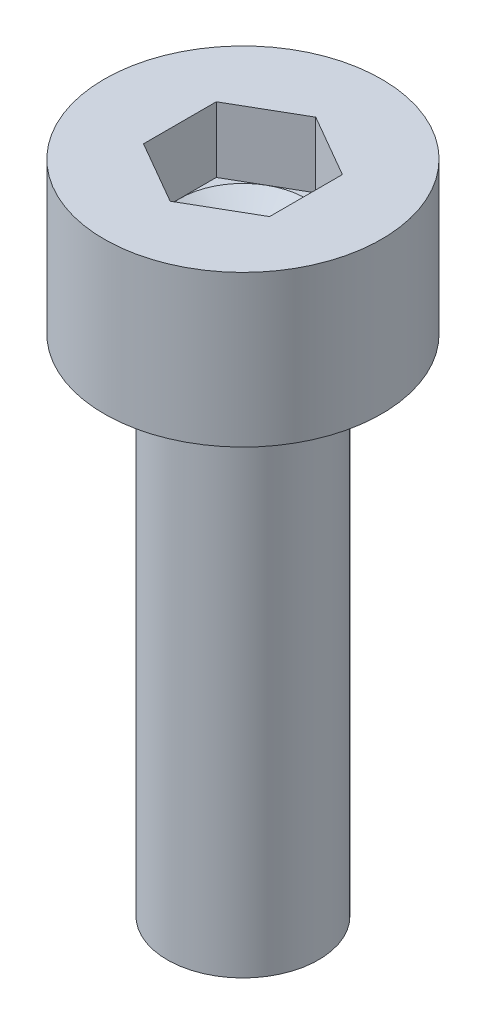
ISO-10303-21;
HEADER;
FILE_DESCRIPTION(('STEP AP214'),'2;1');
FILE_NAME('part.step','',(''),(''),'','','');
FILE_SCHEMA(('AUTOMOTIVE_DESIGN { 1 0 10303 214 1 1 1 1 }'));
ENDSEC;
DATA;
#1=APPLICATION_CONTEXT('core data for automotive mechanical design processes');
#2=APPLICATION_PROTOCOL_DEFINITION('international standard','automotive_design',2000,#1);
#3=PRODUCT_CONTEXT('',#1,'mechanical');
#4=PRODUCT('Part','Part','',(#3));
#5=PRODUCT_RELATED_PRODUCT_CATEGORY('part','',(#4));
#6=PRODUCT_DEFINITION_FORMATION('','',#4);
#7=PRODUCT_DEFINITION_CONTEXT('part definition',#1,'design');
#8=PRODUCT_DEFINITION('design','',#6,#7);
#9=PRODUCT_DEFINITION_SHAPE('','',#8);
#10=(LENGTH_UNIT() NAMED_UNIT(*) SI_UNIT(.MILLI.,.METRE.));
#11=(NAMED_UNIT(*) PLANE_ANGLE_UNIT() SI_UNIT($,.RADIAN.));
#12=(NAMED_UNIT(*) SI_UNIT($,.STERADIAN.) SOLID_ANGLE_UNIT());
#13=UNCERTAINTY_MEASURE_WITH_UNIT(LENGTH_MEASURE(1.E-05),#10,'distance_accuracy_value','');
#14=(GEOMETRIC_REPRESENTATION_CONTEXT(3) GLOBAL_UNCERTAINTY_ASSIGNED_CONTEXT((#13)) GLOBAL_UNIT_ASSIGNED_CONTEXT((#10,
#11,#12)) REPRESENTATION_CONTEXT('',''));
#15=CARTESIAN_POINT('',(0.,0.,0.));
#16=DIRECTION('',(0.,0.,1.));
#17=DIRECTION('',(1.,0.,0.));
#18=AXIS2_PLACEMENT_3D('',#15,#16,#17);
#19=CARTESIAN_POINT('',(0.,0.,0.));
#20=DIRECTION('',(0.,-1.,0.));
#21=DIRECTION('',(1.,0.,0.));
#22=AXIS2_PLACEMENT_3D('',#19,#20,#21);
#23=PLANE('',#22);
#24=CARTESIAN_POINT('',(0.,0.,0.));
#25=DIRECTION('',(0.,1.,0.));
#26=DIRECTION('',(-1.,0.,0.));
#27=AXIS2_PLACEMENT_3D('',#24,#25,#26);
#28=CIRCLE('',#27,2.75);
#29=CARTESIAN_POINT('',(-2.75,0.,0.));
#30=VERTEX_POINT('',#29);
#31=EDGE_CURVE('E11',#30,#30,#28,.T.);
#32=ORIENTED_EDGE('',*,*,#31,.T.);
#33=EDGE_LOOP('',(#32));
#34=FACE_BOUND('',#33,.T.);
#35=DIRECTION('',(-0.866025403784438,0.,0.5));
#36=VECTOR('',#35,1.);
#37=CARTESIAN_POINT('',(0.,0.,-1.44337567297407));
#38=LINE('',#37,#36);
#39=CARTESIAN_POINT('',(0.,0.,-1.44337567297407));
#40=VERTEX_POINT('',#39);
#41=CARTESIAN_POINT('',(-1.25,0.,-0.721687836487033));
#42=VERTEX_POINT('',#41);
#43=EDGE_CURVE('E148',#40,#42,#38,.T.);
#44=ORIENTED_EDGE('',*,*,#43,.F.);
#45=DIRECTION('',(-0.866025403784439,0.,-0.5));
#46=VECTOR('',#45,1.);
#47=CARTESIAN_POINT('',(1.25,0.,-0.721687836487033));
#48=LINE('',#47,#46);
#49=CARTESIAN_POINT('',(1.25,0.,-0.721687836487033));
#50=VERTEX_POINT('',#49);
#51=EDGE_CURVE('E49',#50,#40,#48,.T.);
#52=ORIENTED_EDGE('',*,*,#51,.F.);
#53=DIRECTION('',(0.,0.,-1.));
#54=VECTOR('',#53,1.);
#55=CARTESIAN_POINT('',(1.25,0.,0.721687836487033));
#56=LINE('',#55,#54);
#57=CARTESIAN_POINT('',(1.25,0.,0.721687836487033));
#58=VERTEX_POINT('',#57);
#59=EDGE_CURVE('E119',#58,#50,#56,.T.);
#60=ORIENTED_EDGE('',*,*,#59,.F.);
#61=DIRECTION('',(0.866025403784439,0.,-0.5));
#62=VECTOR('',#61,1.);
#63=CARTESIAN_POINT('',(0.,0.,1.44337567297406));
#64=LINE('',#63,#62);
#65=CARTESIAN_POINT('',(0.,0.,1.44337567297406));
#66=VERTEX_POINT('',#65);
#67=EDGE_CURVE('E155',#66,#58,#64,.T.);
#68=ORIENTED_EDGE('',*,*,#67,.F.);
#69=DIRECTION('',(0.866025403784439,0.,0.5));
#70=VECTOR('',#69,1.);
#71=CARTESIAN_POINT('',(-1.25,0.,0.721687836487032));
#72=LINE('',#71,#70);
#73=CARTESIAN_POINT('',(-1.25,0.,0.721687836487032));
#74=VERTEX_POINT('',#73);
#75=EDGE_CURVE('E152',#74,#66,#72,.T.);
#76=ORIENTED_EDGE('',*,*,#75,.F.);
#77=DIRECTION('',(0.,0.,1.));
#78=VECTOR('',#77,1.);
#79=CARTESIAN_POINT('',(-1.25,0.,-0.721687836487033));
#80=LINE('',#79,#78);
#81=EDGE_CURVE('E150',#42,#74,#80,.T.);
#82=ORIENTED_EDGE('',*,*,#81,.F.);
#83=EDGE_LOOP('',(#44,#52,#60,#68,#76,#82));
#84=FACE_BOUND('',#83,.T.);
#85=ADVANCED_FACE('F35',(#34,#84),#23,.F.);
#86=CARTESIAN_POINT('',(0.,0.,0.));
#87=DIRECTION('',(0.,1.,0.));
#88=DIRECTION('',(-1.,0.,0.));
#89=AXIS2_PLACEMENT_3D('',#86,#87,#88);
#90=CYLINDRICAL_SURFACE('',#89,2.75);
#91=ORIENTED_EDGE('',*,*,#31,.F.);
#92=EDGE_LOOP('',(#91));
#93=FACE_BOUND('',#92,.T.);
#94=CARTESIAN_POINT('',(0.,-3.,0.));
#95=DIRECTION('',(0.,1.,0.));
#96=DIRECTION('',(-1.,0.,0.));
#97=AXIS2_PLACEMENT_3D('',#94,#95,#96);
#98=CIRCLE('',#97,2.75);
#99=CARTESIAN_POINT('',(-2.75,-3.,0.));
#100=VERTEX_POINT('',#99);
#101=EDGE_CURVE('E42',#100,#100,#98,.T.);
#102=ORIENTED_EDGE('',*,*,#101,.T.);
#103=EDGE_LOOP('',(#102));
#104=FACE_BOUND('',#103,.T.);
#105=ADVANCED_FACE('F184',(#93,#104),#90,.T.);
#106=CARTESIAN_POINT('',(2.75,-3.,0.));
#107=DIRECTION('',(0.,1.,0.));
#108=DIRECTION('',(-1.,0.,0.));
#109=AXIS2_PLACEMENT_3D('',#106,#107,#108);
#110=PLANE('',#109);
#111=ORIENTED_EDGE('',*,*,#101,.F.);
#112=EDGE_LOOP('',(#111));
#113=FACE_BOUND('',#112,.T.);
#114=CARTESIAN_POINT('',(0.,-3.,0.));
#115=DIRECTION('',(0.,1.,0.));
#116=DIRECTION('',(-1.,0.,0.));
#117=AXIS2_PLACEMENT_3D('',#114,#115,#116);
#118=CIRCLE('',#117,1.5);
#119=CARTESIAN_POINT('',(-1.5,-3.,0.));
#120=VERTEX_POINT('',#119);
#121=EDGE_CURVE('E179',#120,#120,#118,.T.);
#122=ORIENTED_EDGE('',*,*,#121,.T.);
#123=EDGE_LOOP('',(#122));
#124=FACE_BOUND('',#123,.T.);
#125=ADVANCED_FACE('F186',(#113,#124),#110,.F.);
#126=CARTESIAN_POINT('',(0.,0.,0.));
#127=DIRECTION('',(0.,1.,0.));
#128=DIRECTION('',(-1.,0.,0.));
#129=AXIS2_PLACEMENT_3D('',#126,#127,#128);
#130=CYLINDRICAL_SURFACE('',#129,1.5);
#131=ORIENTED_EDGE('',*,*,#121,.F.);
#132=EDGE_LOOP('',(#131));
#133=FACE_BOUND('',#132,.T.);
#134=CARTESIAN_POINT('',(0.,-13.,0.));
#135=DIRECTION('',(0.,1.,0.));
#136=DIRECTION('',(-1.,0.,0.));
#137=AXIS2_PLACEMENT_3D('',#134,#135,#136);
#138=CIRCLE('',#137,1.5);
#139=CARTESIAN_POINT('',(-1.5,-13.,0.));
#140=VERTEX_POINT('',#139);
#141=EDGE_CURVE('E175',#140,#140,#138,.T.);
#142=ORIENTED_EDGE('',*,*,#141,.T.);
#143=EDGE_LOOP('',(#142));
#144=FACE_BOUND('',#143,.T.);
#145=ADVANCED_FACE('F189',(#133,#144),#130,.T.);
#146=CARTESIAN_POINT('',(1.5,-13.,0.));
#147=DIRECTION('',(0.,1.,0.));
#148=DIRECTION('',(-1.,0.,0.));
#149=AXIS2_PLACEMENT_3D('',#146,#147,#148);
#150=PLANE('',#149);
#151=ORIENTED_EDGE('',*,*,#141,.F.);
#152=EDGE_LOOP('',(#151));
#153=FACE_BOUND('',#152,.T.);
#154=ADVANCED_FACE('F195',(#153),#150,.F.);
#155=CARTESIAN_POINT('',(1.25,-1.3,-0.721687836487033));
#156=DIRECTION('',(0.5,0.,-0.866025403784439));
#157=DIRECTION('',(-0.866025403784439,0.,-0.5));
#158=AXIS2_PLACEMENT_3D('',#155,#156,#157);
#159=PLANE('',#158);
#160=DIRECTION('',(-0.866025403784439,0.,-0.5));
#161=VECTOR('',#160,1.);
#162=CARTESIAN_POINT('',(1.25,-1.3,-0.721687836487033));
#163=LINE('',#162,#161);
#164=CARTESIAN_POINT('',(1.25,-1.3,-0.721687836487033));
#165=VERTEX_POINT('',#164);
#166=CARTESIAN_POINT('',(0.625,-1.3,-1.08253175473055));
#167=VERTEX_POINT('',#166);
#168=EDGE_CURVE('E118',#165,#167,#163,.T.);
#169=ORIENTED_EDGE('',*,*,#168,.F.);
#170=DIRECTION('',(0.,1.,0.));
#171=VECTOR('',#170,1.);
#172=CARTESIAN_POINT('',(1.25,-1.3,-0.721687836487033));
#173=LINE('',#172,#171);
#174=EDGE_CURVE('E158',#165,#50,#173,.T.);
#175=ORIENTED_EDGE('',*,*,#174,.T.);
#176=ORIENTED_EDGE('',*,*,#51,.T.);
#177=DIRECTION('',(0.,1.,0.));
#178=VECTOR('',#177,1.);
#179=CARTESIAN_POINT('',(0.,-1.3,-1.44337567297407));
#180=LINE('',#179,#178);
#181=CARTESIAN_POINT('',(0.,-1.3,-1.44337567297407));
#182=VERTEX_POINT('',#181);
#183=EDGE_CURVE('E121',#182,#40,#180,.T.);
#184=ORIENTED_EDGE('',*,*,#183,.F.);
#185=EDGE_CURVE('E110',#167,#182,#163,.T.);
#186=ORIENTED_EDGE('',*,*,#185,.F.);
#187=EDGE_LOOP('',(#169,#175,#176,#184,#186));
#188=FACE_BOUND('',#187,.T.);
#189=ADVANCED_FACE('F122',(#188),#159,.F.);
#190=CARTESIAN_POINT('',(1.25,-1.3,0.721687836487033));
#191=DIRECTION('',(1.,0.,0.));
#192=DIRECTION('',(0.,0.,-1.));
#193=AXIS2_PLACEMENT_3D('',#190,#191,#192);
#194=PLANE('',#193);
#195=DIRECTION('',(0.,0.,-1.));
#196=VECTOR('',#195,1.);
#197=CARTESIAN_POINT('',(1.25,-1.3,0.721687836487033));
#198=LINE('',#197,#196);
#199=CARTESIAN_POINT('',(1.25,-1.3,0.721687836487033));
#200=VERTEX_POINT('',#199);
#201=CARTESIAN_POINT('',(1.25,-1.3,0.));
#202=VERTEX_POINT('',#201);
#203=EDGE_CURVE('E126',#200,#202,#198,.T.);
#204=ORIENTED_EDGE('',*,*,#203,.F.);
#205=DIRECTION('',(0.,1.,0.));
#206=VECTOR('',#205,1.);
#207=CARTESIAN_POINT('',(1.25,-1.3,0.721687836487033));
#208=LINE('',#207,#206);
#209=EDGE_CURVE('E161',#200,#58,#208,.T.);
#210=ORIENTED_EDGE('',*,*,#209,.T.);
#211=ORIENTED_EDGE('',*,*,#59,.T.);
#212=ORIENTED_EDGE('',*,*,#174,.F.);
#213=EDGE_CURVE('E144',#202,#165,#198,.T.);
#214=ORIENTED_EDGE('',*,*,#213,.F.);
#215=EDGE_LOOP('',(#204,#210,#211,#212,#214));
#216=FACE_BOUND('',#215,.T.);
#217=ADVANCED_FACE('F204',(#216),#194,.F.);
#218=CARTESIAN_POINT('',(0.,-1.3,1.44337567297406));
#219=DIRECTION('',(0.5,0.,0.866025403784439));
#220=DIRECTION('',(0.866025403784439,0.,-0.5));
#221=AXIS2_PLACEMENT_3D('',#218,#219,#220);
#222=PLANE('',#221);
#223=DIRECTION('',(0.866025403784439,0.,-0.5));
#224=VECTOR('',#223,1.);
#225=CARTESIAN_POINT('',(0.,-1.3,1.44337567297406));
#226=LINE('',#225,#224);
#227=CARTESIAN_POINT('',(0.,-1.3,1.44337567297406));
#228=VERTEX_POINT('',#227);
#229=CARTESIAN_POINT('',(0.625,-1.3,1.08253175473055));
#230=VERTEX_POINT('',#229);
#231=EDGE_CURVE('E57',#228,#230,#226,.T.);
#232=ORIENTED_EDGE('',*,*,#231,.F.);
#233=DIRECTION('',(0.,1.,0.));
#234=VECTOR('',#233,1.);
#235=CARTESIAN_POINT('',(0.,-1.3,1.44337567297406));
#236=LINE('',#235,#234);
#237=EDGE_CURVE('E164',#228,#66,#236,.T.);
#238=ORIENTED_EDGE('',*,*,#237,.T.);
#239=ORIENTED_EDGE('',*,*,#67,.T.);
#240=ORIENTED_EDGE('',*,*,#209,.F.);
#241=EDGE_CURVE('E142',#230,#200,#226,.T.);
#242=ORIENTED_EDGE('',*,*,#241,.F.);
#243=EDGE_LOOP('',(#232,#238,#239,#240,#242));
#244=FACE_BOUND('',#243,.T.);
#245=ADVANCED_FACE('F245',(#244),#222,.F.);
#246=CARTESIAN_POINT('',(-1.25,-1.3,0.721687836487032));
#247=DIRECTION('',(-0.5,0.,0.866025403784439));
#248=DIRECTION('',(0.866025403784439,0.,0.5));
#249=AXIS2_PLACEMENT_3D('',#246,#247,#248);
#250=PLANE('',#249);
#251=DIRECTION('',(0.866025403784439,0.,0.5));
#252=VECTOR('',#251,1.);
#253=CARTESIAN_POINT('',(-1.25,-1.3,0.721687836487032));
#254=LINE('',#253,#252);
#255=CARTESIAN_POINT('',(-1.25,-1.3,0.721687836487032));
#256=VERTEX_POINT('',#255);
#257=CARTESIAN_POINT('',(-0.625,-1.3,1.08253175473055));
#258=VERTEX_POINT('',#257);
#259=EDGE_CURVE('E139',#256,#258,#254,.T.);
#260=ORIENTED_EDGE('',*,*,#259,.F.);
#261=DIRECTION('',(0.,1.,0.));
#262=VECTOR('',#261,1.);
#263=CARTESIAN_POINT('',(-1.25,-1.3,0.721687836487032));
#264=LINE('',#263,#262);
#265=EDGE_CURVE('E167',#256,#74,#264,.T.);
#266=ORIENTED_EDGE('',*,*,#265,.T.);
#267=ORIENTED_EDGE('',*,*,#75,.T.);
#268=ORIENTED_EDGE('',*,*,#237,.F.);
#269=EDGE_CURVE('E138',#258,#228,#254,.T.);
#270=ORIENTED_EDGE('',*,*,#269,.F.);
#271=EDGE_LOOP('',(#260,#266,#267,#268,#270));
#272=FACE_BOUND('',#271,.T.);
#273=ADVANCED_FACE('F240',(#272),#250,.F.);
#274=CARTESIAN_POINT('',(-1.25,-1.3,-0.721687836487033));
#275=DIRECTION('',(-1.,0.,0.));
#276=DIRECTION('',(0.,0.,1.));
#277=AXIS2_PLACEMENT_3D('',#274,#275,#276);
#278=PLANE('',#277);
#279=DIRECTION('',(0.,0.,1.));
#280=VECTOR('',#279,1.);
#281=CARTESIAN_POINT('',(-1.25,-1.3,-0.721687836487033));
#282=LINE('',#281,#280);
#283=CARTESIAN_POINT('',(-1.25,-1.3,-0.721687836487033));
#284=VERTEX_POINT('',#283);
#285=CARTESIAN_POINT('',(-1.25,-1.3,0.));
#286=VERTEX_POINT('',#285);
#287=EDGE_CURVE('E134',#284,#286,#282,.T.);
#288=ORIENTED_EDGE('',*,*,#287,.F.);
#289=DIRECTION('',(0.,1.,0.));
#290=VECTOR('',#289,1.);
#291=CARTESIAN_POINT('',(-1.25,-1.3,-0.721687836487033));
#292=LINE('',#291,#290);
#293=EDGE_CURVE('E125',#284,#42,#292,.T.);
#294=ORIENTED_EDGE('',*,*,#293,.T.);
#295=ORIENTED_EDGE('',*,*,#81,.T.);
#296=ORIENTED_EDGE('',*,*,#265,.F.);
#297=EDGE_CURVE('E132',#286,#256,#282,.T.);
#298=ORIENTED_EDGE('',*,*,#297,.F.);
#299=EDGE_LOOP('',(#288,#294,#295,#296,#298));
#300=FACE_BOUND('',#299,.T.);
#301=ADVANCED_FACE('F220',(#300),#278,.F.);
#302=CARTESIAN_POINT('',(0.,-1.3,-1.44337567297407));
#303=DIRECTION('',(-0.5,0.,-0.866025403784438));
#304=DIRECTION('',(-0.866025403784439,0.,0.5));
#305=AXIS2_PLACEMENT_3D('',#302,#303,#304);
#306=PLANE('',#305);
#307=DIRECTION('',(-0.866025403784438,0.,0.5));
#308=VECTOR('',#307,1.);
#309=CARTESIAN_POINT('',(0.,-1.3,-1.44337567297407));
#310=LINE('',#309,#308);
#311=CARTESIAN_POINT('',(-0.625000000000001,-1.3,-1.08253175473055));
#312=VERTEX_POINT('',#311);
#313=EDGE_CURVE('E113',#182,#312,#310,.T.);
#314=ORIENTED_EDGE('',*,*,#313,.F.);
#315=ORIENTED_EDGE('',*,*,#183,.T.);
#316=ORIENTED_EDGE('',*,*,#43,.T.);
#317=ORIENTED_EDGE('',*,*,#293,.F.);
#318=EDGE_CURVE('E131',#312,#284,#310,.T.);
#319=ORIENTED_EDGE('',*,*,#318,.F.);
#320=EDGE_LOOP('',(#314,#315,#316,#317,#319));
#321=FACE_BOUND('',#320,.T.);
#322=ADVANCED_FACE('F129',(#321),#306,.F.);
#323=CARTESIAN_POINT('',(0.,-1.3,0.));
#324=DIRECTION('',(0.,1.,0.));
#325=DIRECTION('',(0.,0.,1.));
#326=AXIS2_PLACEMENT_3D('',#323,#324,#325);
#327=PLANE('',#326);
#328=ORIENTED_EDGE('',*,*,#241,.T.);
#329=ORIENTED_EDGE('',*,*,#203,.T.);
#330=CARTESIAN_POINT('',(0.,-1.3,0.));
#331=DIRECTION('',(0.,1.,0.));
#332=DIRECTION('',(0.,0.,1.));
#333=AXIS2_PLACEMENT_3D('',#330,#331,#332);
#334=CIRCLE('',#333,1.25);
#335=EDGE_CURVE('E172',#230,#202,#334,.T.);
#336=ORIENTED_EDGE('',*,*,#335,.F.);
#337=EDGE_LOOP('',(#328,#329,#336));
#338=FACE_BOUND('',#337,.T.);
#339=ADVANCED_FACE('F251',(#338),#327,.T.);
#340=ORIENTED_EDGE('',*,*,#213,.T.);
#341=ORIENTED_EDGE('',*,*,#168,.T.);
#342=EDGE_CURVE('E176',#202,#167,#334,.T.);
#343=ORIENTED_EDGE('',*,*,#342,.F.);
#344=EDGE_LOOP('',(#340,#341,#343));
#345=FACE_BOUND('',#344,.T.);
#346=ADVANCED_FACE('F253',(#345),#327,.T.);
#347=ORIENTED_EDGE('',*,*,#185,.T.);
#348=ORIENTED_EDGE('',*,*,#313,.T.);
#349=EDGE_CURVE('E115',#167,#312,#334,.T.);
#350=ORIENTED_EDGE('',*,*,#349,.F.);
#351=EDGE_LOOP('',(#347,#348,#350));
#352=FACE_BOUND('',#351,.T.);
#353=ADVANCED_FACE('F111',(#352),#327,.T.);
#354=ORIENTED_EDGE('',*,*,#318,.T.);
#355=ORIENTED_EDGE('',*,*,#287,.T.);
#356=EDGE_CURVE('E226',#312,#286,#334,.T.);
#357=ORIENTED_EDGE('',*,*,#356,.F.);
#358=EDGE_LOOP('',(#354,#355,#357));
#359=FACE_BOUND('',#358,.T.);
#360=ADVANCED_FACE('F225',(#359),#327,.T.);
#361=ORIENTED_EDGE('',*,*,#297,.T.);
#362=ORIENTED_EDGE('',*,*,#259,.T.);
#363=EDGE_CURVE('E232',#286,#258,#334,.T.);
#364=ORIENTED_EDGE('',*,*,#363,.F.);
#365=EDGE_LOOP('',(#361,#362,#364));
#366=FACE_BOUND('',#365,.T.);
#367=ADVANCED_FACE('F242',(#366),#327,.T.);
#368=ORIENTED_EDGE('',*,*,#269,.T.);
#369=ORIENTED_EDGE('',*,*,#231,.T.);
#370=EDGE_CURVE('E160',#258,#230,#334,.T.);
#371=ORIENTED_EDGE('',*,*,#370,.F.);
#372=EDGE_LOOP('',(#368,#369,#371));
#373=FACE_BOUND('',#372,.T.);
#374=ADVANCED_FACE('F236',(#373),#327,.T.);
#375=CARTESIAN_POINT('',(0.,-2.02168783648705,0.));
#376=DIRECTION('',(0.,1.,0.));
#377=DIRECTION('',(0.,0.,1.));
#378=AXIS2_PLACEMENT_3D('',#375,#376,#377);
#379=CONICAL_SURFACE('',#378,0.,1.04719755119659);
#380=ORIENTED_EDGE('',*,*,#335,.T.);
#381=ORIENTED_EDGE('',*,*,#342,.T.);
#382=ORIENTED_EDGE('',*,*,#349,.T.);
#383=ORIENTED_EDGE('',*,*,#356,.T.);
#384=ORIENTED_EDGE('',*,*,#363,.T.);
#385=ORIENTED_EDGE('',*,*,#370,.T.);
#386=EDGE_LOOP('',(#380,#381,#382,#383,#384,#385));
#387=FACE_BOUND('',#386,.T.);
#388=CARTESIAN_POINT('',(0.,-2.02168783648705,0.));
#389=VERTEX_POINT('',#388);
#390=VERTEX_LOOP('',#389);
#391=FACE_BOUND('',#390,.T.);
#392=ADVANCED_FACE('F229',(#387,#391),#379,.F.);
#393=CLOSED_SHELL('',(#85,#105,#125,#145,#154,#189,#217,#245,#273,#301,#322,#339,#346,#353,#360,
#367,#374,#392));
#394=MANIFOLD_SOLID_BREP('B2',#393);
#395=ADVANCED_BREP_SHAPE_REPRESENTATION('',(#18,#394),#14);
#396=SHAPE_DEFINITION_REPRESENTATION(#9,#395);
ENDSEC;
END-ISO-10303-21;
